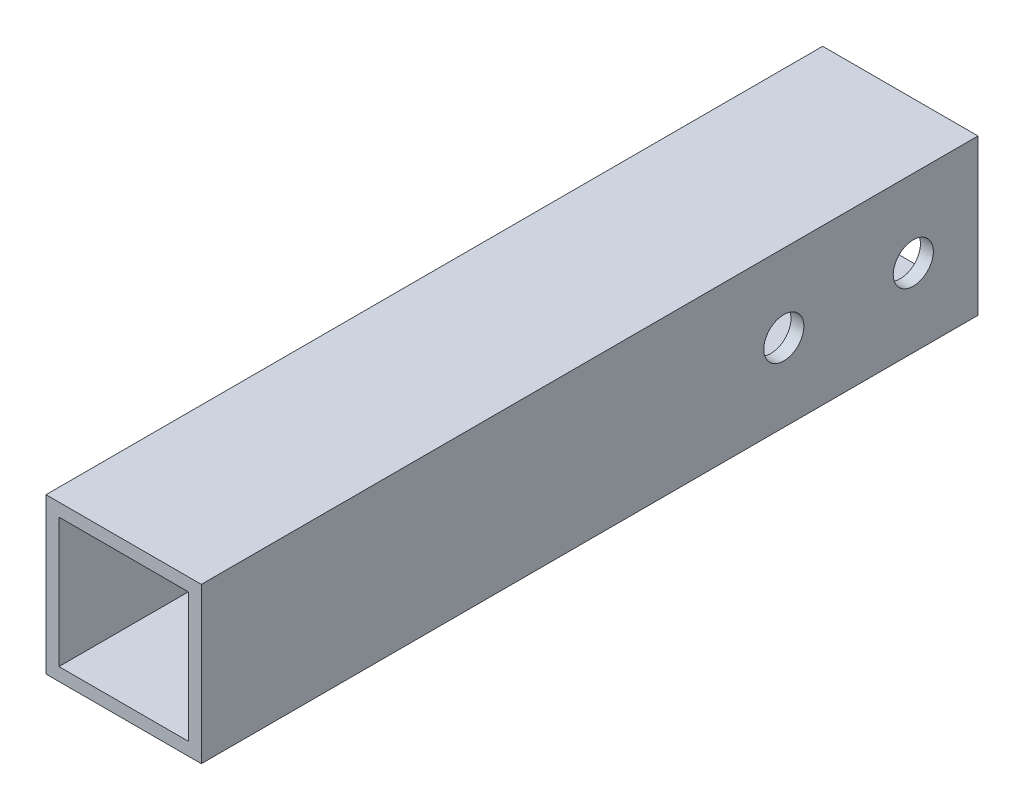
ISO-10303-21;
HEADER;
FILE_DESCRIPTION(('STEP AP214'),'2;1');
FILE_NAME('part.step','',(''),(''),'','','');
FILE_SCHEMA(('AUTOMOTIVE_DESIGN { 1 0 10303 214 1 1 1 1 }'));
ENDSEC;
DATA;
#1=APPLICATION_CONTEXT('core data for automotive mechanical design processes');
#2=APPLICATION_PROTOCOL_DEFINITION('international standard','automotive_design',2000,#1);
#3=PRODUCT_CONTEXT('',#1,'mechanical');
#4=PRODUCT('Part','Part','',(#3));
#5=PRODUCT_RELATED_PRODUCT_CATEGORY('part','',(#4));
#6=PRODUCT_DEFINITION_FORMATION('','',#4);
#7=PRODUCT_DEFINITION_CONTEXT('part definition',#1,'design');
#8=PRODUCT_DEFINITION('design','',#6,#7);
#9=PRODUCT_DEFINITION_SHAPE('','',#8);
#10=(LENGTH_UNIT() NAMED_UNIT(*) SI_UNIT(.MILLI.,.METRE.));
#11=(NAMED_UNIT(*) PLANE_ANGLE_UNIT() SI_UNIT($,.RADIAN.));
#12=(NAMED_UNIT(*) SI_UNIT($,.STERADIAN.) SOLID_ANGLE_UNIT());
#13=UNCERTAINTY_MEASURE_WITH_UNIT(LENGTH_MEASURE(1.E-05),#10,'distance_accuracy_value','');
#14=(GEOMETRIC_REPRESENTATION_CONTEXT(3) GLOBAL_UNCERTAINTY_ASSIGNED_CONTEXT((#13)) GLOBAL_UNIT_ASSIGNED_CONTEXT((#10,
#11,#12)) REPRESENTATION_CONTEXT('',''));
#15=CARTESIAN_POINT('',(0.,0.,0.));
#16=DIRECTION('',(0.,0.,1.));
#17=DIRECTION('',(1.,0.,0.));
#18=AXIS2_PLACEMENT_3D('',#15,#16,#17);
#19=CARTESIAN_POINT('',(0.,0.,-60.));
#20=DIRECTION('',(0.,0.,1.));
#21=DIRECTION('',(-1.,0.,0.));
#22=AXIS2_PLACEMENT_3D('',#19,#20,#21);
#23=PLANE('',#22);
#24=DIRECTION('',(0.,-1.,0.));
#25=VECTOR('',#24,1.);
#26=CARTESIAN_POINT('',(0.,0.,-60.));
#27=LINE('',#26,#25);
#28=CARTESIAN_POINT('',(0.,12.,-60.));
#29=VERTEX_POINT('',#28);
#30=CARTESIAN_POINT('',(0.,0.,-60.));
#31=VERTEX_POINT('',#30);
#32=EDGE_CURVE('E147',#29,#31,#27,.T.);
#33=ORIENTED_EDGE('',*,*,#32,.F.);
#34=DIRECTION('',(-1.,0.,0.));
#35=VECTOR('',#34,1.);
#36=CARTESIAN_POINT('',(0.,12.,-60.));
#37=LINE('',#36,#35);
#38=CARTESIAN_POINT('',(12.,12.,-60.));
#39=VERTEX_POINT('',#38);
#40=EDGE_CURVE('E157',#39,#29,#37,.T.);
#41=ORIENTED_EDGE('',*,*,#40,.F.);
#42=DIRECTION('',(0.,1.,0.));
#43=VECTOR('',#42,1.);
#44=CARTESIAN_POINT('',(12.,0.,-60.));
#45=LINE('',#44,#43);
#46=CARTESIAN_POINT('',(12.,0.,-60.));
#47=VERTEX_POINT('',#46);
#48=EDGE_CURVE('E154',#47,#39,#45,.T.);
#49=ORIENTED_EDGE('',*,*,#48,.F.);
#50=DIRECTION('',(1.,0.,0.));
#51=VECTOR('',#50,1.);
#52=CARTESIAN_POINT('',(0.,0.,-60.));
#53=LINE('',#52,#51);
#54=EDGE_CURVE('E150',#31,#47,#53,.T.);
#55=ORIENTED_EDGE('',*,*,#54,.F.);
#56=EDGE_LOOP('',(#33,#41,#49,#55));
#57=FACE_BOUND('',#56,.T.);
#58=DIRECTION('',(1.,0.,0.));
#59=VECTOR('',#58,1.);
#60=CARTESIAN_POINT('',(1.,1.,-60.));
#61=LINE('',#60,#59);
#62=CARTESIAN_POINT('',(1.,1.,-60.));
#63=VERTEX_POINT('',#62);
#64=CARTESIAN_POINT('',(11.,1.,-60.));
#65=VERTEX_POINT('',#64);
#66=EDGE_CURVE('E112',#63,#65,#61,.T.);
#67=ORIENTED_EDGE('',*,*,#66,.T.);
#68=DIRECTION('',(0.,1.,0.));
#69=VECTOR('',#68,1.);
#70=CARTESIAN_POINT('',(11.,1.,-60.));
#71=LINE('',#70,#69);
#72=CARTESIAN_POINT('',(11.,11.,-60.));
#73=VERTEX_POINT('',#72);
#74=EDGE_CURVE('E121',#65,#73,#71,.T.);
#75=ORIENTED_EDGE('',*,*,#74,.T.);
#76=DIRECTION('',(-1.,0.,0.));
#77=VECTOR('',#76,1.);
#78=CARTESIAN_POINT('',(1.,11.,-60.));
#79=LINE('',#78,#77);
#80=CARTESIAN_POINT('',(1.,11.,-60.));
#81=VERTEX_POINT('',#80);
#82=EDGE_CURVE('E125',#73,#81,#79,.T.);
#83=ORIENTED_EDGE('',*,*,#82,.T.);
#84=DIRECTION('',(0.,-1.,0.));
#85=VECTOR('',#84,1.);
#86=CARTESIAN_POINT('',(1.,1.,-60.));
#87=LINE('',#86,#85);
#88=EDGE_CURVE('E128',#81,#63,#87,.T.);
#89=ORIENTED_EDGE('',*,*,#88,.T.);
#90=EDGE_LOOP('',(#67,#75,#83,#89));
#91=FACE_BOUND('',#90,.T.);
#92=ADVANCED_FACE('F43',(#57,#91),#23,.F.);
#93=CARTESIAN_POINT('',(0.,0.,0.));
#94=DIRECTION('',(0.,0.,1.));
#95=DIRECTION('',(-1.,0.,0.));
#96=AXIS2_PLACEMENT_3D('',#93,#94,#95);
#97=PLANE('',#96);
#98=DIRECTION('',(0.,-1.,0.));
#99=VECTOR('',#98,1.);
#100=CARTESIAN_POINT('',(0.,0.,0.));
#101=LINE('',#100,#99);
#102=CARTESIAN_POINT('',(0.,12.,0.));
#103=VERTEX_POINT('',#102);
#104=CARTESIAN_POINT('',(0.,0.,0.));
#105=VERTEX_POINT('',#104);
#106=EDGE_CURVE('E117',#103,#105,#101,.T.);
#107=ORIENTED_EDGE('',*,*,#106,.T.);
#108=DIRECTION('',(1.,0.,0.));
#109=VECTOR('',#108,1.);
#110=CARTESIAN_POINT('',(0.,0.,0.));
#111=LINE('',#110,#109);
#112=CARTESIAN_POINT('',(12.,0.,0.));
#113=VERTEX_POINT('',#112);
#114=EDGE_CURVE('E163',#105,#113,#111,.T.);
#115=ORIENTED_EDGE('',*,*,#114,.T.);
#116=DIRECTION('',(0.,1.,0.));
#117=VECTOR('',#116,1.);
#118=CARTESIAN_POINT('',(12.,0.,0.));
#119=LINE('',#118,#117);
#120=CARTESIAN_POINT('',(12.,12.,0.));
#121=VERTEX_POINT('',#120);
#122=EDGE_CURVE('E166',#113,#121,#119,.T.);
#123=ORIENTED_EDGE('',*,*,#122,.T.);
#124=DIRECTION('',(-1.,0.,0.));
#125=VECTOR('',#124,1.);
#126=CARTESIAN_POINT('',(0.,12.,0.));
#127=LINE('',#126,#125);
#128=EDGE_CURVE('E151',#121,#103,#127,.T.);
#129=ORIENTED_EDGE('',*,*,#128,.T.);
#130=EDGE_LOOP('',(#107,#115,#123,#129));
#131=FACE_BOUND('',#130,.T.);
#132=DIRECTION('',(0.,-1.,0.));
#133=VECTOR('',#132,1.);
#134=CARTESIAN_POINT('',(1.,1.,0.));
#135=LINE('',#134,#133);
#136=CARTESIAN_POINT('',(1.,11.,0.));
#137=VERTEX_POINT('',#136);
#138=CARTESIAN_POINT('',(1.,1.,0.));
#139=VERTEX_POINT('',#138);
#140=EDGE_CURVE('E129',#137,#139,#135,.T.);
#141=ORIENTED_EDGE('',*,*,#140,.F.);
#142=DIRECTION('',(-1.,0.,0.));
#143=VECTOR('',#142,1.);
#144=CARTESIAN_POINT('',(1.,11.,0.));
#145=LINE('',#144,#143);
#146=CARTESIAN_POINT('',(11.,11.,0.));
#147=VERTEX_POINT('',#146);
#148=EDGE_CURVE('E132',#147,#137,#145,.T.);
#149=ORIENTED_EDGE('',*,*,#148,.F.);
#150=DIRECTION('',(0.,1.,0.));
#151=VECTOR('',#150,1.);
#152=CARTESIAN_POINT('',(11.,1.,0.));
#153=LINE('',#152,#151);
#154=CARTESIAN_POINT('',(11.,1.,0.));
#155=VERTEX_POINT('',#154);
#156=EDGE_CURVE('E141',#155,#147,#153,.T.);
#157=ORIENTED_EDGE('',*,*,#156,.F.);
#158=DIRECTION('',(1.,0.,0.));
#159=VECTOR('',#158,1.);
#160=CARTESIAN_POINT('',(1.,1.,0.));
#161=LINE('',#160,#159);
#162=EDGE_CURVE('E113',#139,#155,#161,.T.);
#163=ORIENTED_EDGE('',*,*,#162,.F.);
#164=EDGE_LOOP('',(#141,#149,#157,#163));
#165=FACE_BOUND('',#164,.T.);
#166=ADVANCED_FACE('F201',(#131,#165),#97,.T.);
#167=CARTESIAN_POINT('',(0.,0.,-60.));
#168=DIRECTION('',(1.,0.,0.));
#169=DIRECTION('',(0.,0.,1.));
#170=AXIS2_PLACEMENT_3D('',#167,#168,#169);
#171=PLANE('',#170);
#172=CARTESIAN_POINT('',(0.,6.,-45.));
#173=DIRECTION('',(-1.,0.,0.));
#174=DIRECTION('',(0.,0.,1.));
#175=AXIS2_PLACEMENT_3D('',#172,#173,#174);
#176=CIRCLE('',#175,1.55);
#177=CARTESIAN_POINT('',(0.,6.,-43.45));
#178=VERTEX_POINT('',#177);
#179=EDGE_CURVE('E177',#178,#178,#176,.T.);
#180=ORIENTED_EDGE('',*,*,#179,.F.);
#181=EDGE_LOOP('',(#180));
#182=FACE_BOUND('',#181,.T.);
#183=CARTESIAN_POINT('',(0.,6.,-55.));
#184=DIRECTION('',(-1.,0.,0.));
#185=DIRECTION('',(0.,0.,1.));
#186=AXIS2_PLACEMENT_3D('',#183,#184,#185);
#187=CIRCLE('',#186,1.55);
#188=CARTESIAN_POINT('',(0.,6.,-53.45));
#189=VERTEX_POINT('',#188);
#190=EDGE_CURVE('E192',#189,#189,#187,.T.);
#191=ORIENTED_EDGE('',*,*,#190,.F.);
#192=EDGE_LOOP('',(#191));
#193=FACE_BOUND('',#192,.T.);
#194=ORIENTED_EDGE('',*,*,#106,.F.);
#195=DIRECTION('',(0.,0.,1.));
#196=VECTOR('',#195,1.);
#197=CARTESIAN_POINT('',(0.,12.,-60.));
#198=LINE('',#197,#196);
#199=EDGE_CURVE('E160',#29,#103,#198,.T.);
#200=ORIENTED_EDGE('',*,*,#199,.F.);
#201=ORIENTED_EDGE('',*,*,#32,.T.);
#202=DIRECTION('',(0.,0.,1.));
#203=VECTOR('',#202,1.);
#204=CARTESIAN_POINT('',(0.,0.,-60.));
#205=LINE('',#204,#203);
#206=EDGE_CURVE('E11',#31,#105,#205,.T.);
#207=ORIENTED_EDGE('',*,*,#206,.T.);
#208=EDGE_LOOP('',(#194,#200,#201,#207));
#209=FACE_BOUND('',#208,.T.);
#210=ADVANCED_FACE('F45',(#182,#193,#209),#171,.F.);
#211=CARTESIAN_POINT('',(0.,0.,-60.));
#212=DIRECTION('',(0.,1.,0.));
#213=DIRECTION('',(0.,0.,-1.));
#214=AXIS2_PLACEMENT_3D('',#211,#212,#213);
#215=PLANE('',#214);
#216=ORIENTED_EDGE('',*,*,#114,.F.);
#217=ORIENTED_EDGE('',*,*,#206,.F.);
#218=ORIENTED_EDGE('',*,*,#54,.T.);
#219=DIRECTION('',(0.,0.,1.));
#220=VECTOR('',#219,1.);
#221=CARTESIAN_POINT('',(12.,0.,-60.));
#222=LINE('',#221,#220);
#223=EDGE_CURVE('E52',#47,#113,#222,.T.);
#224=ORIENTED_EDGE('',*,*,#223,.T.);
#225=EDGE_LOOP('',(#216,#217,#218,#224));
#226=FACE_BOUND('',#225,.T.);
#227=ADVANCED_FACE('F200',(#226),#215,.F.);
#228=CARTESIAN_POINT('',(12.,0.,-60.));
#229=DIRECTION('',(-1.,0.,0.));
#230=DIRECTION('',(0.,0.,-1.));
#231=AXIS2_PLACEMENT_3D('',#228,#229,#230);
#232=PLANE('',#231);
#233=CARTESIAN_POINT('',(12.,6.,-45.));
#234=DIRECTION('',(-1.,0.,0.));
#235=DIRECTION('',(0.,0.,1.));
#236=AXIS2_PLACEMENT_3D('',#233,#234,#235);
#237=CIRCLE('',#236,1.55);
#238=CARTESIAN_POINT('',(12.,6.,-43.45));
#239=VERTEX_POINT('',#238);
#240=EDGE_CURVE('E182',#239,#239,#237,.T.);
#241=ORIENTED_EDGE('',*,*,#240,.T.);
#242=EDGE_LOOP('',(#241));
#243=FACE_BOUND('',#242,.T.);
#244=CARTESIAN_POINT('',(12.,6.,-55.));
#245=DIRECTION('',(-1.,0.,0.));
#246=DIRECTION('',(0.,0.,1.));
#247=AXIS2_PLACEMENT_3D('',#244,#245,#246);
#248=CIRCLE('',#247,1.55);
#249=CARTESIAN_POINT('',(12.,6.,-53.45));
#250=VERTEX_POINT('',#249);
#251=EDGE_CURVE('E187',#250,#250,#248,.T.);
#252=ORIENTED_EDGE('',*,*,#251,.T.);
#253=EDGE_LOOP('',(#252));
#254=FACE_BOUND('',#253,.T.);
#255=ORIENTED_EDGE('',*,*,#122,.F.);
#256=ORIENTED_EDGE('',*,*,#223,.F.);
#257=ORIENTED_EDGE('',*,*,#48,.T.);
#258=DIRECTION('',(0.,0.,1.));
#259=VECTOR('',#258,1.);
#260=CARTESIAN_POINT('',(12.,12.,-60.));
#261=LINE('',#260,#259);
#262=EDGE_CURVE('E172',#39,#121,#261,.T.);
#263=ORIENTED_EDGE('',*,*,#262,.T.);
#264=EDGE_LOOP('',(#255,#256,#257,#263));
#265=FACE_BOUND('',#264,.T.);
#266=ADVANCED_FACE('F218',(#243,#254,#265),#232,.F.);
#267=CARTESIAN_POINT('',(0.,12.,-60.));
#268=DIRECTION('',(0.,-1.,0.));
#269=DIRECTION('',(0.,0.,1.));
#270=AXIS2_PLACEMENT_3D('',#267,#268,#269);
#271=PLANE('',#270);
#272=ORIENTED_EDGE('',*,*,#128,.F.);
#273=ORIENTED_EDGE('',*,*,#262,.F.);
#274=ORIENTED_EDGE('',*,*,#40,.T.);
#275=ORIENTED_EDGE('',*,*,#199,.T.);
#276=EDGE_LOOP('',(#272,#273,#274,#275));
#277=FACE_BOUND('',#276,.T.);
#278=ADVANCED_FACE('F210',(#277),#271,.F.);
#279=CARTESIAN_POINT('',(1.,1.,-60.));
#280=DIRECTION('',(0.,1.,0.));
#281=DIRECTION('',(0.,0.,-1.));
#282=AXIS2_PLACEMENT_3D('',#279,#280,#281);
#283=PLANE('',#282);
#284=ORIENTED_EDGE('',*,*,#162,.T.);
#285=DIRECTION('',(0.,0.,1.));
#286=VECTOR('',#285,1.);
#287=CARTESIAN_POINT('',(11.,1.,-60.));
#288=LINE('',#287,#286);
#289=EDGE_CURVE('E108',#65,#155,#288,.T.);
#290=ORIENTED_EDGE('',*,*,#289,.F.);
#291=ORIENTED_EDGE('',*,*,#66,.F.);
#292=DIRECTION('',(0.,0.,1.));
#293=VECTOR('',#292,1.);
#294=CARTESIAN_POINT('',(1.,1.,-60.));
#295=LINE('',#294,#293);
#296=EDGE_CURVE('E68',#63,#139,#295,.T.);
#297=ORIENTED_EDGE('',*,*,#296,.T.);
#298=EDGE_LOOP('',(#284,#290,#291,#297));
#299=FACE_BOUND('',#298,.T.);
#300=ADVANCED_FACE('F110',(#299),#283,.T.);
#301=CARTESIAN_POINT('',(11.,1.,-60.));
#302=DIRECTION('',(-1.,0.,0.));
#303=DIRECTION('',(0.,0.,-1.));
#304=AXIS2_PLACEMENT_3D('',#301,#302,#303);
#305=PLANE('',#304);
#306=CARTESIAN_POINT('',(11.,6.,-45.));
#307=DIRECTION('',(1.,0.,0.));
#308=DIRECTION('',(0.,0.,-1.));
#309=AXIS2_PLACEMENT_3D('',#306,#307,#308);
#310=CIRCLE('',#309,1.55);
#311=CARTESIAN_POINT('',(11.,6.,-46.55));
#312=VERTEX_POINT('',#311);
#313=EDGE_CURVE('E135',#312,#312,#310,.T.);
#314=ORIENTED_EDGE('',*,*,#313,.T.);
#315=EDGE_LOOP('',(#314));
#316=FACE_BOUND('',#315,.T.);
#317=CARTESIAN_POINT('',(11.,6.,-55.));
#318=DIRECTION('',(1.,0.,0.));
#319=DIRECTION('',(0.,0.,-1.));
#320=AXIS2_PLACEMENT_3D('',#317,#318,#319);
#321=CIRCLE('',#320,1.55);
#322=CARTESIAN_POINT('',(11.,6.,-56.55));
#323=VERTEX_POINT('',#322);
#324=EDGE_CURVE('E176',#323,#323,#321,.T.);
#325=ORIENTED_EDGE('',*,*,#324,.T.);
#326=EDGE_LOOP('',(#325));
#327=FACE_BOUND('',#326,.T.);
#328=ORIENTED_EDGE('',*,*,#156,.T.);
#329=DIRECTION('',(0.,0.,1.));
#330=VECTOR('',#329,1.);
#331=CARTESIAN_POINT('',(11.,11.,-60.));
#332=LINE('',#331,#330);
#333=EDGE_CURVE('E118',#73,#147,#332,.T.);
#334=ORIENTED_EDGE('',*,*,#333,.F.);
#335=ORIENTED_EDGE('',*,*,#74,.F.);
#336=ORIENTED_EDGE('',*,*,#289,.T.);
#337=EDGE_LOOP('',(#328,#334,#335,#336));
#338=FACE_BOUND('',#337,.T.);
#339=ADVANCED_FACE('F122',(#316,#327,#338),#305,.T.);
#340=CARTESIAN_POINT('',(1.,11.,-60.));
#341=DIRECTION('',(0.,-1.,0.));
#342=DIRECTION('',(0.,0.,1.));
#343=AXIS2_PLACEMENT_3D('',#340,#341,#342);
#344=PLANE('',#343);
#345=ORIENTED_EDGE('',*,*,#148,.T.);
#346=DIRECTION('',(0.,0.,1.));
#347=VECTOR('',#346,1.);
#348=CARTESIAN_POINT('',(1.,11.,-60.));
#349=LINE('',#348,#347);
#350=EDGE_CURVE('E60',#81,#137,#349,.T.);
#351=ORIENTED_EDGE('',*,*,#350,.F.);
#352=ORIENTED_EDGE('',*,*,#82,.F.);
#353=ORIENTED_EDGE('',*,*,#333,.T.);
#354=EDGE_LOOP('',(#345,#351,#352,#353));
#355=FACE_BOUND('',#354,.T.);
#356=ADVANCED_FACE('F239',(#355),#344,.T.);
#357=CARTESIAN_POINT('',(1.,1.,-60.));
#358=DIRECTION('',(1.,0.,0.));
#359=DIRECTION('',(0.,0.,1.));
#360=AXIS2_PLACEMENT_3D('',#357,#358,#359);
#361=PLANE('',#360);
#362=CARTESIAN_POINT('',(1.,6.,-45.));
#363=DIRECTION('',(-1.,0.,0.));
#364=DIRECTION('',(0.,0.,1.));
#365=AXIS2_PLACEMENT_3D('',#362,#363,#364);
#366=CIRCLE('',#365,1.55);
#367=CARTESIAN_POINT('',(1.,6.,-43.45));
#368=VERTEX_POINT('',#367);
#369=EDGE_CURVE('E47',#368,#368,#366,.T.);
#370=ORIENTED_EDGE('',*,*,#369,.T.);
#371=EDGE_LOOP('',(#370));
#372=FACE_BOUND('',#371,.T.);
#373=CARTESIAN_POINT('',(1.,6.,-55.));
#374=DIRECTION('',(-1.,0.,0.));
#375=DIRECTION('',(0.,0.,1.));
#376=AXIS2_PLACEMENT_3D('',#373,#374,#375);
#377=CIRCLE('',#376,1.55);
#378=CARTESIAN_POINT('',(1.,6.,-53.45));
#379=VERTEX_POINT('',#378);
#380=EDGE_CURVE('E174',#379,#379,#377,.T.);
#381=ORIENTED_EDGE('',*,*,#380,.T.);
#382=EDGE_LOOP('',(#381));
#383=FACE_BOUND('',#382,.T.);
#384=ORIENTED_EDGE('',*,*,#140,.T.);
#385=ORIENTED_EDGE('',*,*,#296,.F.);
#386=ORIENTED_EDGE('',*,*,#88,.F.);
#387=ORIENTED_EDGE('',*,*,#350,.T.);
#388=EDGE_LOOP('',(#384,#385,#386,#387));
#389=FACE_BOUND('',#388,.T.);
#390=ADVANCED_FACE('F243',(#372,#383,#389),#361,.T.);
#391=CARTESIAN_POINT('',(0.,6.,-55.));
#392=DIRECTION('',(1.,0.,0.));
#393=DIRECTION('',(0.,0.,1.));
#394=AXIS2_PLACEMENT_3D('',#391,#392,#393);
#395=CYLINDRICAL_SURFACE('',#394,1.55);
#396=ORIENTED_EDGE('',*,*,#380,.F.);
#397=EDGE_LOOP('',(#396));
#398=FACE_BOUND('',#397,.T.);
#399=ORIENTED_EDGE('',*,*,#190,.T.);
#400=EDGE_LOOP('',(#399));
#401=FACE_BOUND('',#400,.T.);
#402=ADVANCED_FACE('F196',(#398,#401),#395,.F.);
#403=CARTESIAN_POINT('',(0.,6.,-45.));
#404=DIRECTION('',(1.,0.,0.));
#405=DIRECTION('',(0.,0.,1.));
#406=AXIS2_PLACEMENT_3D('',#403,#404,#405);
#407=CYLINDRICAL_SURFACE('',#406,1.55);
#408=ORIENTED_EDGE('',*,*,#369,.F.);
#409=EDGE_LOOP('',(#408));
#410=FACE_BOUND('',#409,.T.);
#411=ORIENTED_EDGE('',*,*,#179,.T.);
#412=EDGE_LOOP('',(#411));
#413=FACE_BOUND('',#412,.T.);
#414=ADVANCED_FACE('F249',(#410,#413),#407,.F.);
#415=ORIENTED_EDGE('',*,*,#324,.F.);
#416=EDGE_LOOP('',(#415));
#417=FACE_BOUND('',#416,.T.);
#418=ORIENTED_EDGE('',*,*,#251,.F.);
#419=EDGE_LOOP('',(#418));
#420=FACE_BOUND('',#419,.T.);
#421=ADVANCED_FACE('F251',(#417,#420),#395,.F.);
#422=ORIENTED_EDGE('',*,*,#313,.F.);
#423=EDGE_LOOP('',(#422));
#424=FACE_BOUND('',#423,.T.);
#425=ORIENTED_EDGE('',*,*,#240,.F.);
#426=EDGE_LOOP('',(#425));
#427=FACE_BOUND('',#426,.T.);
#428=ADVANCED_FACE('F254',(#424,#427),#407,.F.);
#429=CLOSED_SHELL('',(#92,#166,#210,#227,#266,#278,#300,#339,#356,#390,#402,#414,#421,#428));
#430=MANIFOLD_SOLID_BREP('B2',#429);
#431=ADVANCED_BREP_SHAPE_REPRESENTATION('',(#18,#430),#14);
#432=SHAPE_DEFINITION_REPRESENTATION(#9,#431);
ENDSEC;
END-ISO-10303-21;
